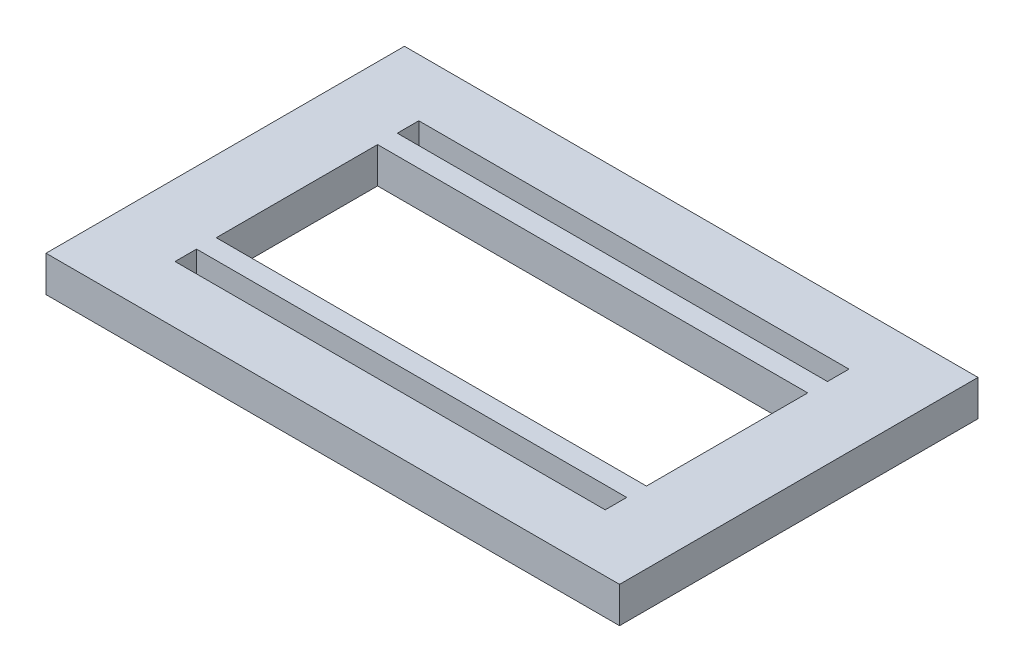
ISO-10303-21;
HEADER;
FILE_DESCRIPTION(('STEP AP214'),'2;1');
FILE_NAME('part.step','',(''),(''),'','','');
FILE_SCHEMA(('AUTOMOTIVE_DESIGN { 1 0 10303 214 1 1 1 1 }'));
ENDSEC;
DATA;
#1=APPLICATION_CONTEXT('core data for automotive mechanical design processes');
#2=APPLICATION_PROTOCOL_DEFINITION('international standard','automotive_design',2000,#1);
#3=PRODUCT_CONTEXT('',#1,'mechanical');
#4=PRODUCT('Part','Part','',(#3));
#5=PRODUCT_RELATED_PRODUCT_CATEGORY('part','',(#4));
#6=PRODUCT_DEFINITION_FORMATION('','',#4);
#7=PRODUCT_DEFINITION_CONTEXT('part definition',#1,'design');
#8=PRODUCT_DEFINITION('design','',#6,#7);
#9=PRODUCT_DEFINITION_SHAPE('','',#8);
#10=(LENGTH_UNIT() NAMED_UNIT(*) SI_UNIT(.MILLI.,.METRE.));
#11=(NAMED_UNIT(*) PLANE_ANGLE_UNIT() SI_UNIT($,.RADIAN.));
#12=(NAMED_UNIT(*) SI_UNIT($,.STERADIAN.) SOLID_ANGLE_UNIT());
#13=UNCERTAINTY_MEASURE_WITH_UNIT(LENGTH_MEASURE(1.E-05),#10,'distance_accuracy_value','');
#14=(GEOMETRIC_REPRESENTATION_CONTEXT(3) GLOBAL_UNCERTAINTY_ASSIGNED_CONTEXT((#13)) GLOBAL_UNIT_ASSIGNED_CONTEXT((#10,
#11,#12)) REPRESENTATION_CONTEXT('',''));
#15=CARTESIAN_POINT('',(0.,0.,0.));
#16=DIRECTION('',(0.,0.,1.));
#17=DIRECTION('',(1.,0.,0.));
#18=AXIS2_PLACEMENT_3D('',#15,#16,#17);
#19=CARTESIAN_POINT('',(0.,5.,0.));
#20=DIRECTION('',(0.,1.,0.));
#21=DIRECTION('',(0.,0.,1.));
#22=AXIS2_PLACEMENT_3D('',#19,#20,#21);
#23=PLANE('',#22);
#24=DIRECTION('',(0.,0.,-1.));
#25=VECTOR('',#24,1.);
#26=CARTESIAN_POINT('',(40.,5.,-25.));
#27=LINE('',#26,#25);
#28=CARTESIAN_POINT('',(40.,5.,25.));
#29=VERTEX_POINT('',#28);
#30=CARTESIAN_POINT('',(40.,5.,-25.));
#31=VERTEX_POINT('',#30);
#32=EDGE_CURVE('E287',#29,#31,#27,.T.);
#33=ORIENTED_EDGE('',*,*,#32,.T.);
#34=DIRECTION('',(-1.,0.,0.));
#35=VECTOR('',#34,1.);
#36=CARTESIAN_POINT('',(-40.,5.,-25.));
#37=LINE('',#36,#35);
#38=CARTESIAN_POINT('',(-40.,5.,-25.));
#39=VERTEX_POINT('',#38);
#40=EDGE_CURVE('E291',#31,#39,#37,.T.);
#41=ORIENTED_EDGE('',*,*,#40,.T.);
#42=DIRECTION('',(0.,0.,1.));
#43=VECTOR('',#42,1.);
#44=CARTESIAN_POINT('',(-40.,5.,-25.));
#45=LINE('',#44,#43);
#46=CARTESIAN_POINT('',(-40.,5.,25.));
#47=VERTEX_POINT('',#46);
#48=EDGE_CURVE('E295',#39,#47,#45,.T.);
#49=ORIENTED_EDGE('',*,*,#48,.T.);
#50=DIRECTION('',(1.,0.,0.));
#51=VECTOR('',#50,1.);
#52=CARTESIAN_POINT('',(-40.,5.,25.));
#53=LINE('',#52,#51);
#54=EDGE_CURVE('E298',#47,#29,#53,.T.);
#55=ORIENTED_EDGE('',*,*,#54,.T.);
#56=EDGE_LOOP('',(#33,#41,#49,#55));
#57=FACE_BOUND('',#56,.T.);
#58=DIRECTION('',(1.,0.,0.));
#59=VECTOR('',#58,1.);
#60=CARTESIAN_POINT('',(-30.,5.,-14.));
#61=LINE('',#60,#59);
#62=CARTESIAN_POINT('',(-30.,5.,-14.));
#63=VERTEX_POINT('',#62);
#64=CARTESIAN_POINT('',(30.,5.,-14.));
#65=VERTEX_POINT('',#64);
#66=EDGE_CURVE('E247',#63,#65,#61,.T.);
#67=ORIENTED_EDGE('',*,*,#66,.F.);
#68=DIRECTION('',(0.,0.,1.));
#69=VECTOR('',#68,1.);
#70=CARTESIAN_POINT('',(-30.,5.,-17.));
#71=LINE('',#70,#69);
#72=CARTESIAN_POINT('',(-30.,5.,-17.));
#73=VERTEX_POINT('',#72);
#74=EDGE_CURVE('E244',#73,#63,#71,.T.);
#75=ORIENTED_EDGE('',*,*,#74,.F.);
#76=DIRECTION('',(-1.,0.,0.));
#77=VECTOR('',#76,1.);
#78=CARTESIAN_POINT('',(-30.,5.,-17.));
#79=LINE('',#78,#77);
#80=CARTESIAN_POINT('',(30.,5.,-17.));
#81=VERTEX_POINT('',#80);
#82=EDGE_CURVE('E255',#81,#73,#79,.T.);
#83=ORIENTED_EDGE('',*,*,#82,.F.);
#84=DIRECTION('',(0.,0.,-1.));
#85=VECTOR('',#84,1.);
#86=CARTESIAN_POINT('',(30.,5.,-17.));
#87=LINE('',#86,#85);
#88=EDGE_CURVE('E251',#65,#81,#87,.T.);
#89=ORIENTED_EDGE('',*,*,#88,.F.);
#90=EDGE_LOOP('',(#67,#75,#83,#89));
#91=FACE_BOUND('',#90,.T.);
#92=DIRECTION('',(0.,0.,-1.));
#93=VECTOR('',#92,1.);
#94=CARTESIAN_POINT('',(30.,5.,17.));
#95=LINE('',#94,#93);
#96=CARTESIAN_POINT('',(30.,5.,17.));
#97=VERTEX_POINT('',#96);
#98=CARTESIAN_POINT('',(30.,5.,14.));
#99=VERTEX_POINT('',#98);
#100=EDGE_CURVE('E204',#97,#99,#95,.T.);
#101=ORIENTED_EDGE('',*,*,#100,.F.);
#102=DIRECTION('',(1.,0.,0.));
#103=VECTOR('',#102,1.);
#104=CARTESIAN_POINT('',(-30.,5.,17.));
#105=LINE('',#104,#103);
#106=CARTESIAN_POINT('',(-30.,5.,17.));
#107=VERTEX_POINT('',#106);
#108=EDGE_CURVE('E201',#107,#97,#105,.T.);
#109=ORIENTED_EDGE('',*,*,#108,.F.);
#110=DIRECTION('',(0.,0.,1.));
#111=VECTOR('',#110,1.);
#112=CARTESIAN_POINT('',(-30.,5.,17.));
#113=LINE('',#112,#111);
#114=CARTESIAN_POINT('',(-30.,5.,14.));
#115=VERTEX_POINT('',#114);
#116=EDGE_CURVE('E212',#115,#107,#113,.T.);
#117=ORIENTED_EDGE('',*,*,#116,.F.);
#118=DIRECTION('',(-1.,0.,0.));
#119=VECTOR('',#118,1.);
#120=CARTESIAN_POINT('',(-30.,5.,14.));
#121=LINE('',#120,#119);
#122=EDGE_CURVE('E208',#99,#115,#121,.T.);
#123=ORIENTED_EDGE('',*,*,#122,.F.);
#124=EDGE_LOOP('',(#101,#109,#117,#123));
#125=FACE_BOUND('',#124,.T.);
#126=DIRECTION('',(-1.,0.,0.));
#127=VECTOR('',#126,1.);
#128=CARTESIAN_POINT('',(-30.,5.,-11.25));
#129=LINE('',#128,#127);
#130=CARTESIAN_POINT('',(30.,5.,-11.25));
#131=VERTEX_POINT('',#130);
#132=CARTESIAN_POINT('',(-30.,5.,-11.25));
#133=VERTEX_POINT('',#132);
#134=EDGE_CURVE('E162',#131,#133,#129,.T.);
#135=ORIENTED_EDGE('',*,*,#134,.F.);
#136=DIRECTION('',(0.,0.,-1.));
#137=VECTOR('',#136,1.);
#138=CARTESIAN_POINT('',(30.,5.,-11.25));
#139=LINE('',#138,#137);
#140=CARTESIAN_POINT('',(30.,5.,11.25));
#141=VERTEX_POINT('',#140);
#142=EDGE_CURVE('E153',#141,#131,#139,.T.);
#143=ORIENTED_EDGE('',*,*,#142,.F.);
#144=DIRECTION('',(1.,0.,0.));
#145=VECTOR('',#144,1.);
#146=CARTESIAN_POINT('',(-30.,5.,11.25));
#147=LINE('',#146,#145);
#148=CARTESIAN_POINT('',(-30.,5.,11.25));
#149=VERTEX_POINT('',#148);
#150=EDGE_CURVE('E179',#149,#141,#147,.T.);
#151=ORIENTED_EDGE('',*,*,#150,.F.);
#152=DIRECTION('',(0.,0.,1.));
#153=VECTOR('',#152,1.);
#154=CARTESIAN_POINT('',(-30.,5.,-11.25));
#155=LINE('',#154,#153);
#156=EDGE_CURVE('E175',#133,#149,#155,.T.);
#157=ORIENTED_EDGE('',*,*,#156,.F.);
#158=EDGE_LOOP('',(#135,#143,#151,#157));
#159=FACE_BOUND('',#158,.T.);
#160=ADVANCED_FACE('F39',(#57,#91,#125,#159),#23,.T.);
#161=CARTESIAN_POINT('',(0.,0.,0.));
#162=DIRECTION('',(0.,1.,0.));
#163=DIRECTION('',(0.,0.,1.));
#164=AXIS2_PLACEMENT_3D('',#161,#162,#163);
#165=PLANE('',#164);
#166=DIRECTION('',(1.,0.,0.));
#167=VECTOR('',#166,1.);
#168=CARTESIAN_POINT('',(-30.,0.,17.));
#169=LINE('',#168,#167);
#170=CARTESIAN_POINT('',(-30.,0.,17.));
#171=VERTEX_POINT('',#170);
#172=CARTESIAN_POINT('',(30.,0.,17.));
#173=VERTEX_POINT('',#172);
#174=EDGE_CURVE('E171',#171,#173,#169,.T.);
#175=ORIENTED_EDGE('',*,*,#174,.T.);
#176=DIRECTION('',(0.,0.,-1.));
#177=VECTOR('',#176,1.);
#178=CARTESIAN_POINT('',(30.,0.,17.));
#179=LINE('',#178,#177);
#180=CARTESIAN_POINT('',(30.,0.,14.));
#181=VERTEX_POINT('',#180);
#182=EDGE_CURVE('E219',#173,#181,#179,.T.);
#183=ORIENTED_EDGE('',*,*,#182,.T.);
#184=DIRECTION('',(-1.,0.,0.));
#185=VECTOR('',#184,1.);
#186=CARTESIAN_POINT('',(-30.,0.,14.));
#187=LINE('',#186,#185);
#188=CARTESIAN_POINT('',(-30.,0.,14.));
#189=VERTEX_POINT('',#188);
#190=EDGE_CURVE('E223',#181,#189,#187,.T.);
#191=ORIENTED_EDGE('',*,*,#190,.T.);
#192=DIRECTION('',(0.,0.,1.));
#193=VECTOR('',#192,1.);
#194=CARTESIAN_POINT('',(-30.,0.,17.));
#195=LINE('',#194,#193);
#196=EDGE_CURVE('E205',#189,#171,#195,.T.);
#197=ORIENTED_EDGE('',*,*,#196,.T.);
#198=EDGE_LOOP('',(#175,#183,#191,#197));
#199=FACE_BOUND('',#198,.T.);
#200=DIRECTION('',(0.,0.,-1.));
#201=VECTOR('',#200,1.);
#202=CARTESIAN_POINT('',(40.,0.,-25.));
#203=LINE('',#202,#201);
#204=CARTESIAN_POINT('',(40.,0.,25.));
#205=VERTEX_POINT('',#204);
#206=CARTESIAN_POINT('',(40.,0.,-25.));
#207=VERTEX_POINT('',#206);
#208=EDGE_CURVE('E286',#205,#207,#203,.T.);
#209=ORIENTED_EDGE('',*,*,#208,.F.);
#210=DIRECTION('',(1.,0.,0.));
#211=VECTOR('',#210,1.);
#212=CARTESIAN_POINT('',(-40.,0.,25.));
#213=LINE('',#212,#211);
#214=CARTESIAN_POINT('',(-40.,0.,25.));
#215=VERTEX_POINT('',#214);
#216=EDGE_CURVE('E292',#215,#205,#213,.T.);
#217=ORIENTED_EDGE('',*,*,#216,.F.);
#218=DIRECTION('',(0.,0.,1.));
#219=VECTOR('',#218,1.);
#220=CARTESIAN_POINT('',(-40.,0.,-25.));
#221=LINE('',#220,#219);
#222=CARTESIAN_POINT('',(-40.,0.,-25.));
#223=VERTEX_POINT('',#222);
#224=EDGE_CURVE('E308',#223,#215,#221,.T.);
#225=ORIENTED_EDGE('',*,*,#224,.F.);
#226=DIRECTION('',(-1.,0.,0.));
#227=VECTOR('',#226,1.);
#228=CARTESIAN_POINT('',(-40.,0.,-25.));
#229=LINE('',#228,#227);
#230=EDGE_CURVE('E305',#207,#223,#229,.T.);
#231=ORIENTED_EDGE('',*,*,#230,.F.);
#232=EDGE_LOOP('',(#209,#217,#225,#231));
#233=FACE_BOUND('',#232,.T.);
#234=DIRECTION('',(0.,0.,1.));
#235=VECTOR('',#234,1.);
#236=CARTESIAN_POINT('',(-30.,0.,-17.));
#237=LINE('',#236,#235);
#238=CARTESIAN_POINT('',(-30.,0.,-17.));
#239=VERTEX_POINT('',#238);
#240=CARTESIAN_POINT('',(-30.,0.,-14.));
#241=VERTEX_POINT('',#240);
#242=EDGE_CURVE('E243',#239,#241,#237,.T.);
#243=ORIENTED_EDGE('',*,*,#242,.T.);
#244=DIRECTION('',(1.,0.,0.));
#245=VECTOR('',#244,1.);
#246=CARTESIAN_POINT('',(-30.,0.,-14.));
#247=LINE('',#246,#245);
#248=CARTESIAN_POINT('',(30.,0.,-14.));
#249=VERTEX_POINT('',#248);
#250=EDGE_CURVE('E262',#241,#249,#247,.T.);
#251=ORIENTED_EDGE('',*,*,#250,.T.);
#252=DIRECTION('',(0.,0.,-1.));
#253=VECTOR('',#252,1.);
#254=CARTESIAN_POINT('',(30.,0.,-17.));
#255=LINE('',#254,#253);
#256=CARTESIAN_POINT('',(30.,0.,-17.));
#257=VERTEX_POINT('',#256);
#258=EDGE_CURVE('E266',#249,#257,#255,.T.);
#259=ORIENTED_EDGE('',*,*,#258,.T.);
#260=DIRECTION('',(-1.,0.,0.));
#261=VECTOR('',#260,1.);
#262=CARTESIAN_POINT('',(-30.,0.,-17.));
#263=LINE('',#262,#261);
#264=EDGE_CURVE('E248',#257,#239,#263,.T.);
#265=ORIENTED_EDGE('',*,*,#264,.T.);
#266=EDGE_LOOP('',(#243,#251,#259,#265));
#267=FACE_BOUND('',#266,.T.);
#268=DIRECTION('',(0.,0.,-1.));
#269=VECTOR('',#268,1.);
#270=CARTESIAN_POINT('',(30.,0.,-11.25));
#271=LINE('',#270,#269);
#272=CARTESIAN_POINT('',(30.,0.,11.25));
#273=VERTEX_POINT('',#272);
#274=CARTESIAN_POINT('',(30.,0.,-11.25));
#275=VERTEX_POINT('',#274);
#276=EDGE_CURVE('E63',#273,#275,#271,.T.);
#277=ORIENTED_EDGE('',*,*,#276,.T.);
#278=DIRECTION('',(-1.,0.,0.));
#279=VECTOR('',#278,1.);
#280=CARTESIAN_POINT('',(-30.,0.,-11.25));
#281=LINE('',#280,#279);
#282=CARTESIAN_POINT('',(-30.,0.,-11.25));
#283=VERTEX_POINT('',#282);
#284=EDGE_CURVE('E169',#275,#283,#281,.T.);
#285=ORIENTED_EDGE('',*,*,#284,.T.);
#286=DIRECTION('',(0.,0.,1.));
#287=VECTOR('',#286,1.);
#288=CARTESIAN_POINT('',(-30.,0.,-11.25));
#289=LINE('',#288,#287);
#290=CARTESIAN_POINT('',(-30.,0.,11.25));
#291=VERTEX_POINT('',#290);
#292=EDGE_CURVE('E188',#283,#291,#289,.T.);
#293=ORIENTED_EDGE('',*,*,#292,.T.);
#294=DIRECTION('',(1.,0.,0.));
#295=VECTOR('',#294,1.);
#296=CARTESIAN_POINT('',(-30.,0.,11.25));
#297=LINE('',#296,#295);
#298=EDGE_CURVE('E163',#291,#273,#297,.T.);
#299=ORIENTED_EDGE('',*,*,#298,.T.);
#300=EDGE_LOOP('',(#277,#285,#293,#299));
#301=FACE_BOUND('',#300,.T.);
#302=ADVANCED_FACE('F331',(#199,#233,#267,#301),#165,.F.);
#303=CARTESIAN_POINT('',(40.,5.,-25.));
#304=DIRECTION('',(-1.,0.,0.));
#305=DIRECTION('',(0.,0.,1.));
#306=AXIS2_PLACEMENT_3D('',#303,#304,#305);
#307=PLANE('',#306);
#308=ORIENTED_EDGE('',*,*,#208,.T.);
#309=DIRECTION('',(0.,-1.,0.));
#310=VECTOR('',#309,1.);
#311=CARTESIAN_POINT('',(40.,5.,-25.));
#312=LINE('',#311,#310);
#313=EDGE_CURVE('E11',#31,#207,#312,.T.);
#314=ORIENTED_EDGE('',*,*,#313,.F.);
#315=ORIENTED_EDGE('',*,*,#32,.F.);
#316=DIRECTION('',(0.,-1.,0.));
#317=VECTOR('',#316,1.);
#318=CARTESIAN_POINT('',(40.,5.,25.));
#319=LINE('',#318,#317);
#320=EDGE_CURVE('E301',#29,#205,#319,.T.);
#321=ORIENTED_EDGE('',*,*,#320,.T.);
#322=EDGE_LOOP('',(#308,#314,#315,#321));
#323=FACE_BOUND('',#322,.T.);
#324=ADVANCED_FACE('F41',(#323),#307,.F.);
#325=CARTESIAN_POINT('',(-40.,5.,-25.));
#326=DIRECTION('',(0.,0.,1.));
#327=DIRECTION('',(1.,0.,0.));
#328=AXIS2_PLACEMENT_3D('',#325,#326,#327);
#329=PLANE('',#328);
#330=ORIENTED_EDGE('',*,*,#230,.T.);
#331=DIRECTION('',(0.,-1.,0.));
#332=VECTOR('',#331,1.);
#333=CARTESIAN_POINT('',(-40.,5.,-25.));
#334=LINE('',#333,#332);
#335=EDGE_CURVE('E48',#39,#223,#334,.T.);
#336=ORIENTED_EDGE('',*,*,#335,.F.);
#337=ORIENTED_EDGE('',*,*,#40,.F.);
#338=ORIENTED_EDGE('',*,*,#313,.T.);
#339=EDGE_LOOP('',(#330,#336,#337,#338));
#340=FACE_BOUND('',#339,.T.);
#341=ADVANCED_FACE('F342',(#340),#329,.F.);
#342=CARTESIAN_POINT('',(-40.,5.,-25.));
#343=DIRECTION('',(1.,0.,0.));
#344=DIRECTION('',(0.,0.,-1.));
#345=AXIS2_PLACEMENT_3D('',#342,#343,#344);
#346=PLANE('',#345);
#347=ORIENTED_EDGE('',*,*,#224,.T.);
#348=DIRECTION('',(0.,-1.,0.));
#349=VECTOR('',#348,1.);
#350=CARTESIAN_POINT('',(-40.,5.,25.));
#351=LINE('',#350,#349);
#352=EDGE_CURVE('E316',#47,#215,#351,.T.);
#353=ORIENTED_EDGE('',*,*,#352,.F.);
#354=ORIENTED_EDGE('',*,*,#48,.F.);
#355=ORIENTED_EDGE('',*,*,#335,.T.);
#356=EDGE_LOOP('',(#347,#353,#354,#355));
#357=FACE_BOUND('',#356,.T.);
#358=ADVANCED_FACE('F325',(#357),#346,.F.);
#359=CARTESIAN_POINT('',(-40.,5.,25.));
#360=DIRECTION('',(0.,0.,-1.));
#361=DIRECTION('',(-1.,0.,0.));
#362=AXIS2_PLACEMENT_3D('',#359,#360,#361);
#363=PLANE('',#362);
#364=ORIENTED_EDGE('',*,*,#216,.T.);
#365=ORIENTED_EDGE('',*,*,#320,.F.);
#366=ORIENTED_EDGE('',*,*,#54,.F.);
#367=ORIENTED_EDGE('',*,*,#352,.T.);
#368=EDGE_LOOP('',(#364,#365,#366,#367));
#369=FACE_BOUND('',#368,.T.);
#370=ADVANCED_FACE('F335',(#369),#363,.F.);
#371=CARTESIAN_POINT('',(-30.,5.,-17.));
#372=DIRECTION('',(1.,0.,0.));
#373=DIRECTION('',(0.,0.,-1.));
#374=AXIS2_PLACEMENT_3D('',#371,#372,#373);
#375=PLANE('',#374);
#376=ORIENTED_EDGE('',*,*,#242,.F.);
#377=DIRECTION('',(0.,-1.,0.));
#378=VECTOR('',#377,1.);
#379=CARTESIAN_POINT('',(-30.,5.,-17.));
#380=LINE('',#379,#378);
#381=EDGE_CURVE('E258',#73,#239,#380,.T.);
#382=ORIENTED_EDGE('',*,*,#381,.F.);
#383=ORIENTED_EDGE('',*,*,#74,.T.);
#384=DIRECTION('',(0.,-1.,0.));
#385=VECTOR('',#384,1.);
#386=CARTESIAN_POINT('',(-30.,5.,-14.));
#387=LINE('',#386,#385);
#388=EDGE_CURVE('E282',#63,#241,#387,.T.);
#389=ORIENTED_EDGE('',*,*,#388,.T.);
#390=EDGE_LOOP('',(#376,#382,#383,#389));
#391=FACE_BOUND('',#390,.T.);
#392=ADVANCED_FACE('F357',(#391),#375,.T.);
#393=CARTESIAN_POINT('',(-30.,5.,-14.));
#394=DIRECTION('',(0.,0.,-1.));
#395=DIRECTION('',(-1.,0.,0.));
#396=AXIS2_PLACEMENT_3D('',#393,#394,#395);
#397=PLANE('',#396);
#398=ORIENTED_EDGE('',*,*,#250,.F.);
#399=ORIENTED_EDGE('',*,*,#388,.F.);
#400=ORIENTED_EDGE('',*,*,#66,.T.);
#401=DIRECTION('',(0.,-1.,0.));
#402=VECTOR('',#401,1.);
#403=CARTESIAN_POINT('',(30.,5.,-14.));
#404=LINE('',#403,#402);
#405=EDGE_CURVE('E279',#65,#249,#404,.T.);
#406=ORIENTED_EDGE('',*,*,#405,.T.);
#407=EDGE_LOOP('',(#398,#399,#400,#406));
#408=FACE_BOUND('',#407,.T.);
#409=ADVANCED_FACE('F364',(#408),#397,.T.);
#410=CARTESIAN_POINT('',(30.,5.,-17.));
#411=DIRECTION('',(-1.,0.,0.));
#412=DIRECTION('',(0.,0.,1.));
#413=AXIS2_PLACEMENT_3D('',#410,#411,#412);
#414=PLANE('',#413);
#415=ORIENTED_EDGE('',*,*,#258,.F.);
#416=ORIENTED_EDGE('',*,*,#405,.F.);
#417=ORIENTED_EDGE('',*,*,#88,.T.);
#418=DIRECTION('',(0.,-1.,0.));
#419=VECTOR('',#418,1.);
#420=CARTESIAN_POINT('',(30.,5.,-17.));
#421=LINE('',#420,#419);
#422=EDGE_CURVE('E276',#81,#257,#421,.T.);
#423=ORIENTED_EDGE('',*,*,#422,.T.);
#424=EDGE_LOOP('',(#415,#416,#417,#423));
#425=FACE_BOUND('',#424,.T.);
#426=ADVANCED_FACE('F369',(#425),#414,.T.);
#427=CARTESIAN_POINT('',(-30.,5.,-17.));
#428=DIRECTION('',(0.,0.,1.));
#429=DIRECTION('',(1.,0.,0.));
#430=AXIS2_PLACEMENT_3D('',#427,#428,#429);
#431=PLANE('',#430);
#432=ORIENTED_EDGE('',*,*,#264,.F.);
#433=ORIENTED_EDGE('',*,*,#422,.F.);
#434=ORIENTED_EDGE('',*,*,#82,.T.);
#435=ORIENTED_EDGE('',*,*,#381,.T.);
#436=EDGE_LOOP('',(#432,#433,#434,#435));
#437=FACE_BOUND('',#436,.T.);
#438=ADVANCED_FACE('F376',(#437),#431,.T.);
#439=CARTESIAN_POINT('',(-30.,5.,17.));
#440=DIRECTION('',(0.,0.,-1.));
#441=DIRECTION('',(-1.,0.,0.));
#442=AXIS2_PLACEMENT_3D('',#439,#440,#441);
#443=PLANE('',#442);
#444=ORIENTED_EDGE('',*,*,#174,.F.);
#445=DIRECTION('',(0.,-1.,0.));
#446=VECTOR('',#445,1.);
#447=CARTESIAN_POINT('',(-30.,5.,17.));
#448=LINE('',#447,#446);
#449=EDGE_CURVE('E215',#107,#171,#448,.T.);
#450=ORIENTED_EDGE('',*,*,#449,.F.);
#451=ORIENTED_EDGE('',*,*,#108,.T.);
#452=DIRECTION('',(0.,-1.,0.));
#453=VECTOR('',#452,1.);
#454=CARTESIAN_POINT('',(30.,5.,17.));
#455=LINE('',#454,#453);
#456=EDGE_CURVE('E239',#97,#173,#455,.T.);
#457=ORIENTED_EDGE('',*,*,#456,.T.);
#458=EDGE_LOOP('',(#444,#450,#451,#457));
#459=FACE_BOUND('',#458,.T.);
#460=ADVANCED_FACE('F398',(#459),#443,.T.);
#461=CARTESIAN_POINT('',(30.,5.,17.));
#462=DIRECTION('',(-1.,0.,0.));
#463=DIRECTION('',(0.,0.,1.));
#464=AXIS2_PLACEMENT_3D('',#461,#462,#463);
#465=PLANE('',#464);
#466=ORIENTED_EDGE('',*,*,#182,.F.);
#467=ORIENTED_EDGE('',*,*,#456,.F.);
#468=ORIENTED_EDGE('',*,*,#100,.T.);
#469=DIRECTION('',(0.,-1.,0.));
#470=VECTOR('',#469,1.);
#471=CARTESIAN_POINT('',(30.,5.,14.));
#472=LINE('',#471,#470);
#473=EDGE_CURVE('E236',#99,#181,#472,.T.);
#474=ORIENTED_EDGE('',*,*,#473,.T.);
#475=EDGE_LOOP('',(#466,#467,#468,#474));
#476=FACE_BOUND('',#475,.T.);
#477=ADVANCED_FACE('F392',(#476),#465,.T.);
#478=CARTESIAN_POINT('',(-30.,5.,14.));
#479=DIRECTION('',(0.,0.,1.));
#480=DIRECTION('',(1.,0.,0.));
#481=AXIS2_PLACEMENT_3D('',#478,#479,#480);
#482=PLANE('',#481);
#483=ORIENTED_EDGE('',*,*,#190,.F.);
#484=ORIENTED_EDGE('',*,*,#473,.F.);
#485=ORIENTED_EDGE('',*,*,#122,.T.);
#486=DIRECTION('',(0.,-1.,0.));
#487=VECTOR('',#486,1.);
#488=CARTESIAN_POINT('',(-30.,5.,14.));
#489=LINE('',#488,#487);
#490=EDGE_CURVE('E233',#115,#189,#489,.T.);
#491=ORIENTED_EDGE('',*,*,#490,.T.);
#492=EDGE_LOOP('',(#483,#484,#485,#491));
#493=FACE_BOUND('',#492,.T.);
#494=ADVANCED_FACE('F395',(#493),#482,.T.);
#495=CARTESIAN_POINT('',(-30.,5.,17.));
#496=DIRECTION('',(1.,0.,0.));
#497=DIRECTION('',(0.,0.,-1.));
#498=AXIS2_PLACEMENT_3D('',#495,#496,#497);
#499=PLANE('',#498);
#500=ORIENTED_EDGE('',*,*,#196,.F.);
#501=ORIENTED_EDGE('',*,*,#490,.F.);
#502=ORIENTED_EDGE('',*,*,#116,.T.);
#503=ORIENTED_EDGE('',*,*,#449,.T.);
#504=EDGE_LOOP('',(#500,#501,#502,#503));
#505=FACE_BOUND('',#504,.T.);
#506=ADVANCED_FACE('F401',(#505),#499,.T.);
#507=CARTESIAN_POINT('',(30.,5.,-11.25));
#508=DIRECTION('',(-1.,0.,0.));
#509=DIRECTION('',(0.,0.,1.));
#510=AXIS2_PLACEMENT_3D('',#507,#508,#509);
#511=PLANE('',#510);
#512=ORIENTED_EDGE('',*,*,#276,.F.);
#513=DIRECTION('',(0.,-1.,0.));
#514=VECTOR('',#513,1.);
#515=CARTESIAN_POINT('',(30.,5.,11.25));
#516=LINE('',#515,#514);
#517=EDGE_CURVE('E157',#141,#273,#516,.T.);
#518=ORIENTED_EDGE('',*,*,#517,.F.);
#519=ORIENTED_EDGE('',*,*,#142,.T.);
#520=DIRECTION('',(0.,-1.,0.));
#521=VECTOR('',#520,1.);
#522=CARTESIAN_POINT('',(30.,5.,-11.25));
#523=LINE('',#522,#521);
#524=EDGE_CURVE('E156',#131,#275,#523,.T.);
#525=ORIENTED_EDGE('',*,*,#524,.T.);
#526=EDGE_LOOP('',(#512,#518,#519,#525));
#527=FACE_BOUND('',#526,.T.);
#528=ADVANCED_FACE('F155',(#527),#511,.T.);
#529=CARTESIAN_POINT('',(-30.,5.,-11.25));
#530=DIRECTION('',(0.,0.,1.));
#531=DIRECTION('',(1.,0.,0.));
#532=AXIS2_PLACEMENT_3D('',#529,#530,#531);
#533=PLANE('',#532);
#534=ORIENTED_EDGE('',*,*,#284,.F.);
#535=ORIENTED_EDGE('',*,*,#524,.F.);
#536=ORIENTED_EDGE('',*,*,#134,.T.);
#537=DIRECTION('',(0.,-1.,0.));
#538=VECTOR('',#537,1.);
#539=CARTESIAN_POINT('',(-30.,5.,-11.25));
#540=LINE('',#539,#538);
#541=EDGE_CURVE('E172',#133,#283,#540,.T.);
#542=ORIENTED_EDGE('',*,*,#541,.T.);
#543=EDGE_LOOP('',(#534,#535,#536,#542));
#544=FACE_BOUND('',#543,.T.);
#545=ADVANCED_FACE('F166',(#544),#533,.T.);
#546=CARTESIAN_POINT('',(-30.,5.,-11.25));
#547=DIRECTION('',(1.,0.,0.));
#548=DIRECTION('',(0.,0.,-1.));
#549=AXIS2_PLACEMENT_3D('',#546,#547,#548);
#550=PLANE('',#549);
#551=ORIENTED_EDGE('',*,*,#292,.F.);
#552=ORIENTED_EDGE('',*,*,#541,.F.);
#553=ORIENTED_EDGE('',*,*,#156,.T.);
#554=DIRECTION('',(0.,-1.,0.));
#555=VECTOR('',#554,1.);
#556=CARTESIAN_POINT('',(-30.,5.,11.25));
#557=LINE('',#556,#555);
#558=EDGE_CURVE('E55',#149,#291,#557,.T.);
#559=ORIENTED_EDGE('',*,*,#558,.T.);
#560=EDGE_LOOP('',(#551,#552,#553,#559));
#561=FACE_BOUND('',#560,.T.);
#562=ADVANCED_FACE('F458',(#561),#550,.T.);
#563=CARTESIAN_POINT('',(-30.,5.,11.25));
#564=DIRECTION('',(0.,0.,-1.));
#565=DIRECTION('',(-1.,0.,0.));
#566=AXIS2_PLACEMENT_3D('',#563,#564,#565);
#567=PLANE('',#566);
#568=ORIENTED_EDGE('',*,*,#298,.F.);
#569=ORIENTED_EDGE('',*,*,#558,.F.);
#570=ORIENTED_EDGE('',*,*,#150,.T.);
#571=ORIENTED_EDGE('',*,*,#517,.T.);
#572=EDGE_LOOP('',(#568,#569,#570,#571));
#573=FACE_BOUND('',#572,.T.);
#574=ADVANCED_FACE('F466',(#573),#567,.T.);
#575=CLOSED_SHELL('',(#160,#302,#324,#341,#358,#370,#392,#409,#426,#438,#460,#477,#494,#506,
#528,#545,#562,#574));
#576=MANIFOLD_SOLID_BREP('B2',#575);
#577=ADVANCED_BREP_SHAPE_REPRESENTATION('',(#18,#576),#14);
#578=SHAPE_DEFINITION_REPRESENTATION(#9,#577);
ENDSEC;
END-ISO-10303-21;
